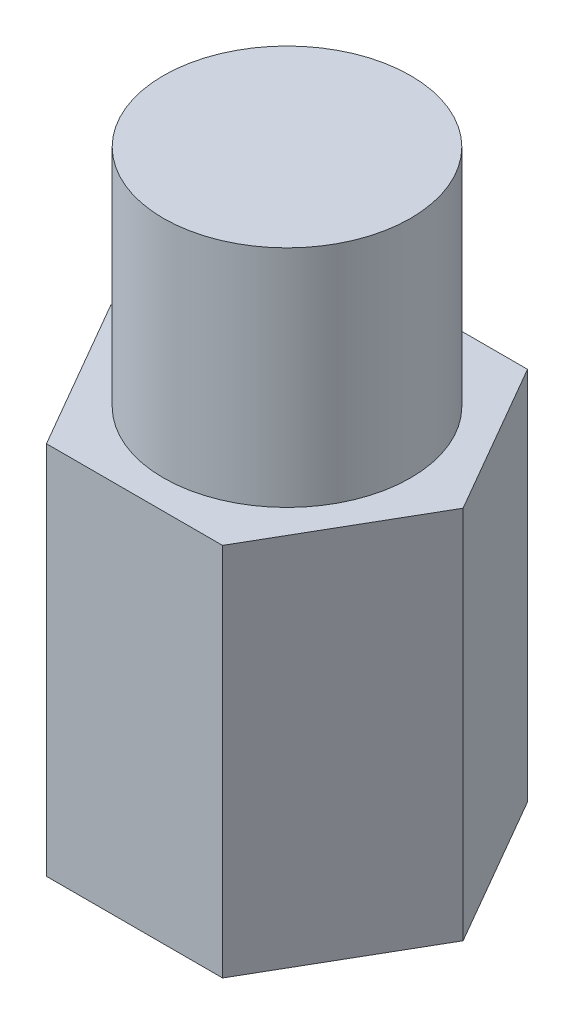
ISO-10303-21;
HEADER;
FILE_DESCRIPTION(('STEP AP214'),'2;1');
FILE_NAME('part.step','',(''),(''),'','','');
FILE_SCHEMA(('AUTOMOTIVE_DESIGN { 1 0 10303 214 1 1 1 1 }'));
ENDSEC;
DATA;
#1=APPLICATION_CONTEXT('core data for automotive mechanical design processes');
#2=APPLICATION_PROTOCOL_DEFINITION('international standard','automotive_design',2000,#1);
#3=PRODUCT_CONTEXT('',#1,'mechanical');
#4=PRODUCT('Part','Part','',(#3));
#5=PRODUCT_RELATED_PRODUCT_CATEGORY('part','',(#4));
#6=PRODUCT_DEFINITION_FORMATION('','',#4);
#7=PRODUCT_DEFINITION_CONTEXT('part definition',#1,'design');
#8=PRODUCT_DEFINITION('design','',#6,#7);
#9=PRODUCT_DEFINITION_SHAPE('','',#8);
#10=(LENGTH_UNIT() NAMED_UNIT(*) SI_UNIT(.MILLI.,.METRE.));
#11=(NAMED_UNIT(*) PLANE_ANGLE_UNIT() SI_UNIT($,.RADIAN.));
#12=(NAMED_UNIT(*) SI_UNIT($,.STERADIAN.) SOLID_ANGLE_UNIT());
#13=UNCERTAINTY_MEASURE_WITH_UNIT(LENGTH_MEASURE(1.E-05),#10,'distance_accuracy_value','');
#14=(GEOMETRIC_REPRESENTATION_CONTEXT(3) GLOBAL_UNCERTAINTY_ASSIGNED_CONTEXT((#13)) GLOBAL_UNIT_ASSIGNED_CONTEXT((#10,
#11,#12)) REPRESENTATION_CONTEXT('',''));
#15=CARTESIAN_POINT('',(0.,0.,0.));
#16=DIRECTION('',(0.,0.,1.));
#17=DIRECTION('',(1.,0.,0.));
#18=AXIS2_PLACEMENT_3D('',#15,#16,#17);
#19=CARTESIAN_POINT('',(-1.17500000000001,5.,2.03515969889343));
#20=DIRECTION('',(0.,0.,-1.));
#21=DIRECTION('',(-1.,0.,0.));
#22=AXIS2_PLACEMENT_3D('',#19,#20,#21);
#23=PLANE('',#22);
#24=DIRECTION('',(1.,0.,0.));
#25=VECTOR('',#24,1.);
#26=CARTESIAN_POINT('',(-1.17500000000001,0.,2.03515969889343));
#27=LINE('',#26,#25);
#28=CARTESIAN_POINT('',(-1.17500000000001,0.,2.03515969889343));
#29=VERTEX_POINT('',#28);
#30=CARTESIAN_POINT('',(1.175,0.,2.03515969889343));
#31=VERTEX_POINT('',#30);
#32=EDGE_CURVE('E121',#29,#31,#27,.T.);
#33=ORIENTED_EDGE('',*,*,#32,.T.);
#34=DIRECTION('',(0.,-1.,0.));
#35=VECTOR('',#34,1.);
#36=CARTESIAN_POINT('',(1.175,5.,2.03515969889343));
#37=LINE('',#36,#35);
#38=CARTESIAN_POINT('',(1.175,5.,2.03515969889343));
#39=VERTEX_POINT('',#38);
#40=EDGE_CURVE('E38',#39,#31,#37,.T.);
#41=ORIENTED_EDGE('',*,*,#40,.F.);
#42=DIRECTION('',(1.,0.,0.));
#43=VECTOR('',#42,1.);
#44=CARTESIAN_POINT('',(-1.17500000000001,5.,2.03515969889343));
#45=LINE('',#44,#43);
#46=CARTESIAN_POINT('',(-1.17500000000001,5.,2.03515969889343));
#47=VERTEX_POINT('',#46);
#48=EDGE_CURVE('E132',#47,#39,#45,.T.);
#49=ORIENTED_EDGE('',*,*,#48,.F.);
#50=DIRECTION('',(0.,-1.,0.));
#51=VECTOR('',#50,1.);
#52=CARTESIAN_POINT('',(-1.17500000000001,5.,2.03515969889343));
#53=LINE('',#52,#51);
#54=EDGE_CURVE('E117',#47,#29,#53,.T.);
#55=ORIENTED_EDGE('',*,*,#54,.T.);
#56=EDGE_LOOP('',(#33,#41,#49,#55));
#57=FACE_BOUND('',#56,.T.);
#58=ADVANCED_FACE('F35',(#57),#23,.F.);
#59=CARTESIAN_POINT('',(1.175,5.,2.03515969889343));
#60=DIRECTION('',(-0.866025403784439,0.,-0.499999999999999));
#61=DIRECTION('',(-0.499999999999999,0.,0.866025403784439));
#62=AXIS2_PLACEMENT_3D('',#59,#60,#61);
#63=PLANE('',#62);
#64=DIRECTION('',(0.499999999999999,0.,-0.866025403784439));
#65=VECTOR('',#64,1.);
#66=CARTESIAN_POINT('',(1.175,0.,2.03515969889343));
#67=LINE('',#66,#65);
#68=CARTESIAN_POINT('',(2.35,0.,0.));
#69=VERTEX_POINT('',#68);
#70=EDGE_CURVE('E124',#31,#69,#67,.T.);
#71=ORIENTED_EDGE('',*,*,#70,.T.);
#72=DIRECTION('',(0.,-1.,0.));
#73=VECTOR('',#72,1.);
#74=CARTESIAN_POINT('',(2.35,5.,0.));
#75=LINE('',#74,#73);
#76=CARTESIAN_POINT('',(2.35,5.,0.));
#77=VERTEX_POINT('',#76);
#78=EDGE_CURVE('E135',#77,#69,#75,.T.);
#79=ORIENTED_EDGE('',*,*,#78,.F.);
#80=DIRECTION('',(0.499999999999999,0.,-0.866025403784439));
#81=VECTOR('',#80,1.);
#82=CARTESIAN_POINT('',(1.175,5.,2.03515969889343));
#83=LINE('',#82,#81);
#84=EDGE_CURVE('E90',#39,#77,#83,.T.);
#85=ORIENTED_EDGE('',*,*,#84,.F.);
#86=ORIENTED_EDGE('',*,*,#40,.T.);
#87=EDGE_LOOP('',(#71,#79,#85,#86));
#88=FACE_BOUND('',#87,.T.);
#89=ADVANCED_FACE('F140',(#88),#63,.F.);
#90=CARTESIAN_POINT('',(2.35,5.,0.));
#91=DIRECTION('',(-0.866025403784438,0.,0.500000000000002));
#92=DIRECTION('',(0.500000000000002,0.,0.866025403784438));
#93=AXIS2_PLACEMENT_3D('',#90,#91,#92);
#94=PLANE('',#93);
#95=DIRECTION('',(-0.500000000000002,0.,-0.866025403784438));
#96=VECTOR('',#95,1.);
#97=CARTESIAN_POINT('',(2.35,0.,0.));
#98=LINE('',#97,#96);
#99=CARTESIAN_POINT('',(1.17499999999999,0.,-2.03515969889343));
#100=VERTEX_POINT('',#99);
#101=EDGE_CURVE('E127',#69,#100,#98,.T.);
#102=ORIENTED_EDGE('',*,*,#101,.T.);
#103=DIRECTION('',(0.,-1.,0.));
#104=VECTOR('',#103,1.);
#105=CARTESIAN_POINT('',(1.17499999999999,5.,-2.03515969889343));
#106=LINE('',#105,#104);
#107=CARTESIAN_POINT('',(1.17499999999999,5.,-2.03515969889343));
#108=VERTEX_POINT('',#107);
#109=EDGE_CURVE('E112',#108,#100,#106,.T.);
#110=ORIENTED_EDGE('',*,*,#109,.F.);
#111=DIRECTION('',(-0.500000000000002,0.,-0.866025403784438));
#112=VECTOR('',#111,1.);
#113=CARTESIAN_POINT('',(2.35,5.,0.));
#114=LINE('',#113,#112);
#115=EDGE_CURVE('E103',#77,#108,#114,.T.);
#116=ORIENTED_EDGE('',*,*,#115,.F.);
#117=ORIENTED_EDGE('',*,*,#78,.T.);
#118=EDGE_LOOP('',(#102,#110,#116,#117));
#119=FACE_BOUND('',#118,.T.);
#120=ADVANCED_FACE('F146',(#119),#94,.F.);
#121=CARTESIAN_POINT('',(1.17499999999999,5.,-2.03515969889343));
#122=DIRECTION('',(0.,0.,1.));
#123=DIRECTION('',(1.,0.,0.));
#124=AXIS2_PLACEMENT_3D('',#121,#122,#123);
#125=PLANE('',#124);
#126=DIRECTION('',(-1.,0.,0.));
#127=VECTOR('',#126,1.);
#128=CARTESIAN_POINT('',(1.17499999999999,0.,-2.03515969889343));
#129=LINE('',#128,#127);
#130=CARTESIAN_POINT('',(-1.175,0.,-2.03515969889343));
#131=VERTEX_POINT('',#130);
#132=EDGE_CURVE('E111',#100,#131,#129,.T.);
#133=ORIENTED_EDGE('',*,*,#132,.T.);
#134=DIRECTION('',(0.,-1.,0.));
#135=VECTOR('',#134,1.);
#136=CARTESIAN_POINT('',(-1.175,5.,-2.03515969889343));
#137=LINE('',#136,#135);
#138=CARTESIAN_POINT('',(-1.175,5.,-2.03515969889343));
#139=VERTEX_POINT('',#138);
#140=EDGE_CURVE('E108',#139,#131,#137,.T.);
#141=ORIENTED_EDGE('',*,*,#140,.F.);
#142=DIRECTION('',(-1.,0.,0.));
#143=VECTOR('',#142,1.);
#144=CARTESIAN_POINT('',(1.17499999999999,5.,-2.03515969889343));
#145=LINE('',#144,#143);
#146=EDGE_CURVE('E97',#108,#139,#145,.T.);
#147=ORIENTED_EDGE('',*,*,#146,.F.);
#148=ORIENTED_EDGE('',*,*,#109,.T.);
#149=EDGE_LOOP('',(#133,#141,#147,#148));
#150=FACE_BOUND('',#149,.T.);
#151=ADVANCED_FACE('F109',(#150),#125,.F.);
#152=CARTESIAN_POINT('',(-1.175,5.,-2.03515969889343));
#153=DIRECTION('',(0.866025403784438,0.,0.5));
#154=DIRECTION('',(0.5,0.,-0.866025403784438));
#155=AXIS2_PLACEMENT_3D('',#152,#153,#154);
#156=PLANE('',#155);
#157=DIRECTION('',(-0.5,0.,0.866025403784438));
#158=VECTOR('',#157,1.);
#159=CARTESIAN_POINT('',(-1.175,0.,-2.03515969889343));
#160=LINE('',#159,#158);
#161=CARTESIAN_POINT('',(-2.35,0.,0.));
#162=VERTEX_POINT('',#161);
#163=EDGE_CURVE('E75',#131,#162,#160,.T.);
#164=ORIENTED_EDGE('',*,*,#163,.T.);
#165=DIRECTION('',(0.,-1.,0.));
#166=VECTOR('',#165,1.);
#167=CARTESIAN_POINT('',(-2.35,5.,0.));
#168=LINE('',#167,#166);
#169=CARTESIAN_POINT('',(-2.35,5.,0.));
#170=VERTEX_POINT('',#169);
#171=EDGE_CURVE('E113',#170,#162,#168,.T.);
#172=ORIENTED_EDGE('',*,*,#171,.F.);
#173=DIRECTION('',(-0.5,0.,0.866025403784438));
#174=VECTOR('',#173,1.);
#175=CARTESIAN_POINT('',(-1.175,5.,-2.03515969889343));
#176=LINE('',#175,#174);
#177=EDGE_CURVE('E101',#139,#170,#176,.T.);
#178=ORIENTED_EDGE('',*,*,#177,.F.);
#179=ORIENTED_EDGE('',*,*,#140,.T.);
#180=EDGE_LOOP('',(#164,#172,#178,#179));
#181=FACE_BOUND('',#180,.T.);
#182=ADVANCED_FACE('F115',(#181),#156,.F.);
#183=CARTESIAN_POINT('',(-2.35,5.,0.));
#184=DIRECTION('',(0.86602540378444,0.,-0.499999999999998));
#185=DIRECTION('',(-0.499999999999998,0.,-0.86602540378444));
#186=AXIS2_PLACEMENT_3D('',#183,#184,#185);
#187=PLANE('',#186);
#188=DIRECTION('',(0.499999999999998,0.,0.86602540378444));
#189=VECTOR('',#188,1.);
#190=CARTESIAN_POINT('',(-2.35,0.,0.));
#191=LINE('',#190,#189);
#192=EDGE_CURVE('E81',#162,#29,#191,.T.);
#193=ORIENTED_EDGE('',*,*,#192,.T.);
#194=ORIENTED_EDGE('',*,*,#54,.F.);
#195=DIRECTION('',(0.499999999999998,0.,0.86602540378444));
#196=VECTOR('',#195,1.);
#197=CARTESIAN_POINT('',(-2.35,5.,0.));
#198=LINE('',#197,#196);
#199=EDGE_CURVE('E52',#170,#47,#198,.T.);
#200=ORIENTED_EDGE('',*,*,#199,.F.);
#201=ORIENTED_EDGE('',*,*,#171,.T.);
#202=EDGE_LOOP('',(#193,#194,#200,#201));
#203=FACE_BOUND('',#202,.T.);
#204=ADVANCED_FACE('F177',(#203),#187,.F.);
#205=CARTESIAN_POINT('',(0.,5.,0.));
#206=DIRECTION('',(0.,1.,0.));
#207=DIRECTION('',(0.,0.,1.));
#208=AXIS2_PLACEMENT_3D('',#205,#206,#207);
#209=PLANE('',#208);
#210=CARTESIAN_POINT('',(0.,5.,0.));
#211=DIRECTION('',(0.,1.,0.));
#212=DIRECTION('',(0.,0.,1.));
#213=AXIS2_PLACEMENT_3D('',#210,#211,#212);
#214=CIRCLE('',#213,1.65);
#215=CARTESIAN_POINT('',(0.,5.,1.65));
#216=VERTEX_POINT('',#215);
#217=EDGE_CURVE('E11',#216,#216,#214,.T.);
#218=ORIENTED_EDGE('',*,*,#217,.F.);
#219=EDGE_LOOP('',(#218));
#220=FACE_BOUND('',#219,.T.);
#221=ORIENTED_EDGE('',*,*,#48,.T.);
#222=ORIENTED_EDGE('',*,*,#84,.T.);
#223=ORIENTED_EDGE('',*,*,#115,.T.);
#224=ORIENTED_EDGE('',*,*,#146,.T.);
#225=ORIENTED_EDGE('',*,*,#177,.T.);
#226=ORIENTED_EDGE('',*,*,#199,.T.);
#227=EDGE_LOOP('',(#221,#222,#223,#224,#225,#226));
#228=FACE_BOUND('',#227,.T.);
#229=ADVANCED_FACE('F99',(#220,#228),#209,.T.);
#230=CARTESIAN_POINT('',(0.,0.,0.));
#231=DIRECTION('',(0.,1.,0.));
#232=DIRECTION('',(0.,0.,1.));
#233=AXIS2_PLACEMENT_3D('',#230,#231,#232);
#234=PLANE('',#233);
#235=CARTESIAN_POINT('',(0.,0.,0.));
#236=DIRECTION('',(0.,-1.,0.));
#237=DIRECTION('',(0.,0.,-1.));
#238=AXIS2_PLACEMENT_3D('',#235,#236,#237);
#239=CIRCLE('',#238,1.65);
#240=CARTESIAN_POINT('',(0.,0.,-1.65));
#241=VERTEX_POINT('',#240);
#242=EDGE_CURVE('E153',#241,#241,#239,.T.);
#243=ORIENTED_EDGE('',*,*,#242,.F.);
#244=EDGE_LOOP('',(#243));
#245=FACE_BOUND('',#244,.T.);
#246=ORIENTED_EDGE('',*,*,#32,.F.);
#247=ORIENTED_EDGE('',*,*,#192,.F.);
#248=ORIENTED_EDGE('',*,*,#163,.F.);
#249=ORIENTED_EDGE('',*,*,#132,.F.);
#250=ORIENTED_EDGE('',*,*,#101,.F.);
#251=ORIENTED_EDGE('',*,*,#70,.F.);
#252=EDGE_LOOP('',(#246,#247,#248,#249,#250,#251));
#253=FACE_BOUND('',#252,.T.);
#254=ADVANCED_FACE('F145',(#245,#253),#234,.F.);
#255=CARTESIAN_POINT('',(0.,8.,0.));
#256=DIRECTION('',(0.,-1.,0.));
#257=DIRECTION('',(0.,0.,-1.));
#258=AXIS2_PLACEMENT_3D('',#255,#256,#257);
#259=CYLINDRICAL_SURFACE('',#258,1.65);
#260=CARTESIAN_POINT('',(0.,8.,0.));
#261=DIRECTION('',(0.,1.,0.));
#262=DIRECTION('',(0.,0.,1.));
#263=AXIS2_PLACEMENT_3D('',#260,#261,#262);
#264=CIRCLE('',#263,1.65);
#265=CARTESIAN_POINT('',(0.,8.,1.65));
#266=VERTEX_POINT('',#265);
#267=EDGE_CURVE('E125',#266,#266,#264,.T.);
#268=ORIENTED_EDGE('',*,*,#267,.F.);
#269=EDGE_LOOP('',(#268));
#270=FACE_BOUND('',#269,.T.);
#271=ORIENTED_EDGE('',*,*,#217,.T.);
#272=EDGE_LOOP('',(#271));
#273=FACE_BOUND('',#272,.T.);
#274=ADVANCED_FACE('F169',(#270,#273),#259,.T.);
#275=CARTESIAN_POINT('',(0.,8.,0.));
#276=DIRECTION('',(0.,1.,0.));
#277=DIRECTION('',(0.,0.,1.));
#278=AXIS2_PLACEMENT_3D('',#275,#276,#277);
#279=PLANE('',#278);
#280=ORIENTED_EDGE('',*,*,#267,.T.);
#281=EDGE_LOOP('',(#280));
#282=FACE_BOUND('',#281,.T.);
#283=ADVANCED_FACE('F164',(#282),#279,.T.);
#284=CARTESIAN_POINT('',(0.,3.,0.));
#285=DIRECTION('',(0.,-1.,0.));
#286=DIRECTION('',(0.,0.,-1.));
#287=AXIS2_PLACEMENT_3D('',#284,#285,#286);
#288=CYLINDRICAL_SURFACE('',#287,1.65);
#289=CARTESIAN_POINT('',(0.,3.,0.));
#290=DIRECTION('',(0.,-1.,0.));
#291=DIRECTION('',(0.,0.,-1.));
#292=AXIS2_PLACEMENT_3D('',#289,#290,#291);
#293=CIRCLE('',#292,1.65);
#294=CARTESIAN_POINT('',(0.,3.,-1.65));
#295=VERTEX_POINT('',#294);
#296=EDGE_CURVE('E152',#295,#295,#293,.T.);
#297=ORIENTED_EDGE('',*,*,#296,.F.);
#298=EDGE_LOOP('',(#297));
#299=FACE_BOUND('',#298,.T.);
#300=ORIENTED_EDGE('',*,*,#242,.T.);
#301=EDGE_LOOP('',(#300));
#302=FACE_BOUND('',#301,.T.);
#303=ADVANCED_FACE('F161',(#299,#302),#288,.F.);
#304=CARTESIAN_POINT('',(0.,3.,0.));
#305=DIRECTION('',(0.,-1.,0.));
#306=DIRECTION('',(0.,0.,-1.));
#307=AXIS2_PLACEMENT_3D('',#304,#305,#306);
#308=PLANE('',#307);
#309=ORIENTED_EDGE('',*,*,#296,.T.);
#310=EDGE_LOOP('',(#309));
#311=FACE_BOUND('',#310,.T.);
#312=ADVANCED_FACE('F159',(#311),#308,.T.);
#313=CLOSED_SHELL('',(#58,#89,#120,#151,#182,#204,#229,#254,#274,#283,#303,#312));
#314=MANIFOLD_SOLID_BREP('B2',#313);
#315=ADVANCED_BREP_SHAPE_REPRESENTATION('',(#18,#314),#14);
#316=SHAPE_DEFINITION_REPRESENTATION(#9,#315);
ENDSEC;
END-ISO-10303-21;
